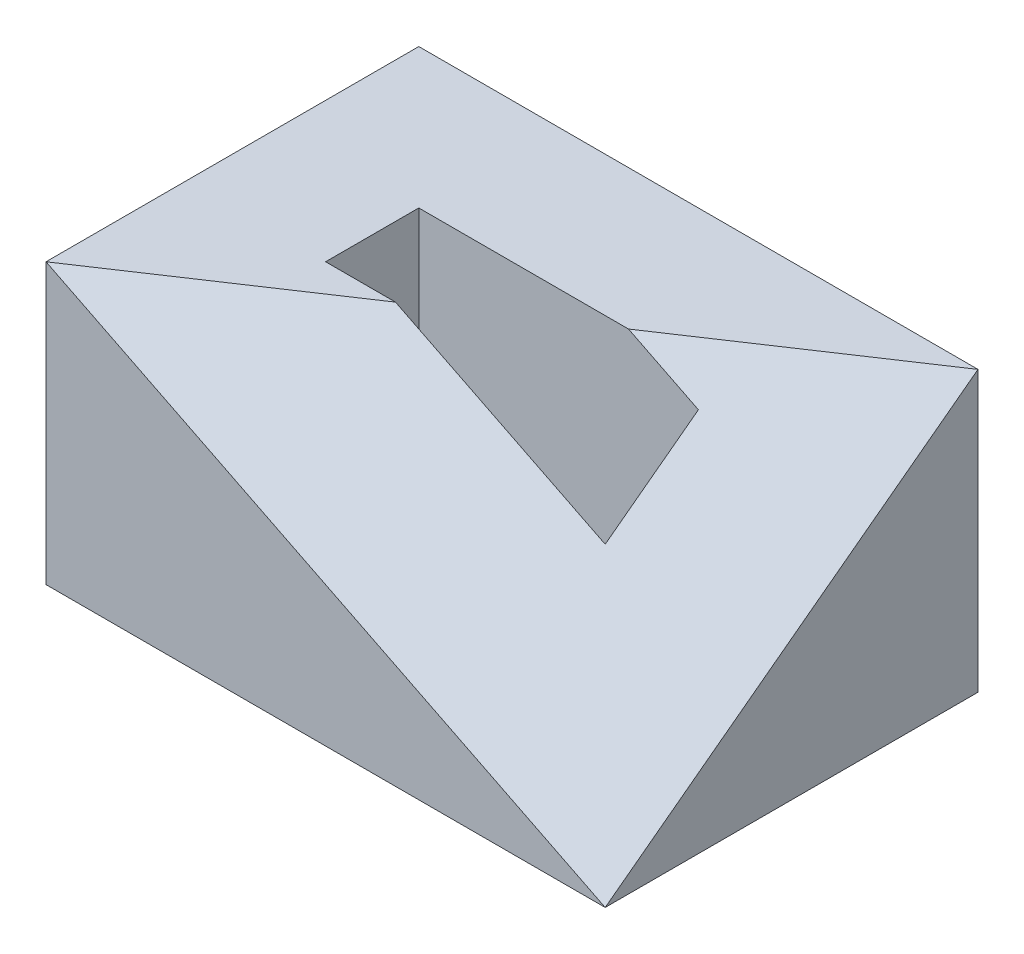
ISO-10303-21;
HEADER;
FILE_DESCRIPTION(('STEP AP214'),'2;1');
FILE_NAME('part.step','',(''),(''),'','','');
FILE_SCHEMA(('AUTOMOTIVE_DESIGN { 1 0 10303 214 1 1 1 1 }'));
ENDSEC;
DATA;
#1=APPLICATION_CONTEXT('core data for automotive mechanical design processes');
#2=APPLICATION_PROTOCOL_DEFINITION('international standard','automotive_design',2000,#1);
#3=PRODUCT_CONTEXT('',#1,'mechanical');
#4=PRODUCT('Part','Part','',(#3));
#5=PRODUCT_RELATED_PRODUCT_CATEGORY('part','',(#4));
#6=PRODUCT_DEFINITION_FORMATION('','',#4);
#7=PRODUCT_DEFINITION_CONTEXT('part definition',#1,'design');
#8=PRODUCT_DEFINITION('design','',#6,#7);
#9=PRODUCT_DEFINITION_SHAPE('','',#8);
#10=(LENGTH_UNIT() NAMED_UNIT(*) SI_UNIT(.MILLI.,.METRE.));
#11=(NAMED_UNIT(*) PLANE_ANGLE_UNIT() SI_UNIT($,.RADIAN.));
#12=(NAMED_UNIT(*) SI_UNIT($,.STERADIAN.) SOLID_ANGLE_UNIT());
#13=UNCERTAINTY_MEASURE_WITH_UNIT(LENGTH_MEASURE(1.E-05),#10,'distance_accuracy_value','');
#14=(GEOMETRIC_REPRESENTATION_CONTEXT(3) GLOBAL_UNCERTAINTY_ASSIGNED_CONTEXT((#13)) GLOBAL_UNIT_ASSIGNED_CONTEXT((#10,
#11,#12)) REPRESENTATION_CONTEXT('',''));
#15=CARTESIAN_POINT('',(0.,0.,0.));
#16=DIRECTION('',(0.,0.,1.));
#17=DIRECTION('',(1.,0.,0.));
#18=AXIS2_PLACEMENT_3D('',#15,#16,#17);
#19=CARTESIAN_POINT('',(60.,30.,0.));
#20=DIRECTION('',(-1.,0.,0.));
#21=DIRECTION('',(0.,0.,1.));
#22=AXIS2_PLACEMENT_3D('',#19,#20,#21);
#23=PLANE('',#22);
#24=DIRECTION('',(0.,0.6,-0.8));
#25=VECTOR('',#24,1.);
#26=CARTESIAN_POINT('',(60.,0.,0.));
#27=LINE('',#26,#25);
#28=CARTESIAN_POINT('',(60.,0.,0.));
#29=VERTEX_POINT('',#28);
#30=CARTESIAN_POINT('',(60.,30.,-40.));
#31=VERTEX_POINT('',#30);
#32=EDGE_CURVE('E135',#29,#31,#27,.T.);
#33=ORIENTED_EDGE('',*,*,#32,.F.);
#34=DIRECTION('',(0.,0.,-1.));
#35=VECTOR('',#34,1.);
#36=CARTESIAN_POINT('',(60.,0.,0.));
#37=LINE('',#36,#35);
#38=CARTESIAN_POINT('',(60.,0.,-40.));
#39=VERTEX_POINT('',#38);
#40=EDGE_CURVE('E173',#29,#39,#37,.T.);
#41=ORIENTED_EDGE('',*,*,#40,.T.);
#42=DIRECTION('',(0.,-1.,0.));
#43=VECTOR('',#42,1.);
#44=CARTESIAN_POINT('',(60.,30.,-40.));
#45=LINE('',#44,#43);
#46=EDGE_CURVE('E169',#31,#39,#45,.T.);
#47=ORIENTED_EDGE('',*,*,#46,.F.);
#48=EDGE_LOOP('',(#33,#41,#47));
#49=FACE_BOUND('',#48,.T.);
#50=ADVANCED_FACE('F36',(#49),#23,.F.);
#51=CARTESIAN_POINT('',(0.,30.,0.));
#52=DIRECTION('',(0.,-1.,0.));
#53=DIRECTION('',(0.,0.,-1.));
#54=AXIS2_PLACEMENT_3D('',#51,#52,#53);
#55=PLANE('',#54);
#56=DIRECTION('',(0.,0.,1.));
#57=VECTOR('',#56,1.);
#58=CARTESIAN_POINT('',(15.,30.,-25.));
#59=LINE('',#58,#57);
#60=CARTESIAN_POINT('',(15.,30.,-25.));
#61=VERTEX_POINT('',#60);
#62=CARTESIAN_POINT('',(15.,30.,-15.));
#63=VERTEX_POINT('',#62);
#64=EDGE_CURVE('E110',#61,#63,#59,.T.);
#65=ORIENTED_EDGE('',*,*,#64,.F.);
#66=DIRECTION('',(-1.,0.,0.));
#67=VECTOR('',#66,1.);
#68=CARTESIAN_POINT('',(45.,30.,-25.));
#69=LINE('',#68,#67);
#70=CARTESIAN_POINT('',(37.5,30.,-25.));
#71=VERTEX_POINT('',#70);
#72=EDGE_CURVE('E107',#71,#61,#69,.T.);
#73=ORIENTED_EDGE('',*,*,#72,.F.);
#74=DIRECTION('',(-0.832050294337844,0.,0.554700196225229));
#75=VECTOR('',#74,1.);
#76=CARTESIAN_POINT('',(60.,30.,-40.));
#77=LINE('',#76,#75);
#78=EDGE_CURVE('E136',#31,#71,#77,.T.);
#79=ORIENTED_EDGE('',*,*,#78,.F.);
#80=DIRECTION('',(-1.,0.,0.));
#81=VECTOR('',#80,1.);
#82=CARTESIAN_POINT('',(0.,30.,-40.));
#83=LINE('',#82,#81);
#84=CARTESIAN_POINT('',(0.,30.,-40.));
#85=VERTEX_POINT('',#84);
#86=EDGE_CURVE('E164',#31,#85,#83,.T.);
#87=ORIENTED_EDGE('',*,*,#86,.T.);
#88=DIRECTION('',(0.,0.,1.));
#89=VECTOR('',#88,1.);
#90=CARTESIAN_POINT('',(0.,30.,0.));
#91=LINE('',#90,#89);
#92=CARTESIAN_POINT('',(0.,30.,0.));
#93=VERTEX_POINT('',#92);
#94=EDGE_CURVE('E181',#85,#93,#91,.T.);
#95=ORIENTED_EDGE('',*,*,#94,.T.);
#96=CARTESIAN_POINT('',(22.5,30.,-15.));
#97=VERTEX_POINT('',#96);
#98=EDGE_CURVE('E121',#97,#93,#77,.T.);
#99=ORIENTED_EDGE('',*,*,#98,.F.);
#100=DIRECTION('',(1.,0.,0.));
#101=VECTOR('',#100,1.);
#102=CARTESIAN_POINT('',(15.,30.,-15.));
#103=LINE('',#102,#101);
#104=EDGE_CURVE('E57',#63,#97,#103,.T.);
#105=ORIENTED_EDGE('',*,*,#104,.F.);
#106=EDGE_LOOP('',(#65,#73,#79,#87,#95,#99,#105));
#107=FACE_BOUND('',#106,.T.);
#108=ADVANCED_FACE('F119',(#107),#55,.F.);
#109=CARTESIAN_POINT('',(0.,30.,0.));
#110=DIRECTION('',(1.,0.,0.));
#111=DIRECTION('',(0.,0.,-1.));
#112=AXIS2_PLACEMENT_3D('',#109,#110,#111);
#113=PLANE('',#112);
#114=DIRECTION('',(0.,0.,1.));
#115=VECTOR('',#114,1.);
#116=CARTESIAN_POINT('',(0.,0.,0.));
#117=LINE('',#116,#115);
#118=CARTESIAN_POINT('',(0.,0.,-40.));
#119=VERTEX_POINT('',#118);
#120=CARTESIAN_POINT('',(0.,0.,0.));
#121=VERTEX_POINT('',#120);
#122=EDGE_CURVE('E139',#119,#121,#117,.T.);
#123=ORIENTED_EDGE('',*,*,#122,.T.);
#124=DIRECTION('',(0.,-1.,0.));
#125=VECTOR('',#124,1.);
#126=CARTESIAN_POINT('',(0.,30.,0.));
#127=LINE('',#126,#125);
#128=EDGE_CURVE('E153',#93,#121,#127,.T.);
#129=ORIENTED_EDGE('',*,*,#128,.F.);
#130=ORIENTED_EDGE('',*,*,#94,.F.);
#131=DIRECTION('',(0.,-1.,0.));
#132=VECTOR('',#131,1.);
#133=CARTESIAN_POINT('',(0.,30.,-40.));
#134=LINE('',#133,#132);
#135=EDGE_CURVE('E176',#85,#119,#134,.T.);
#136=ORIENTED_EDGE('',*,*,#135,.T.);
#137=EDGE_LOOP('',(#123,#129,#130,#136));
#138=FACE_BOUND('',#137,.T.);
#139=ADVANCED_FACE('F38',(#138),#113,.F.);
#140=CARTESIAN_POINT('',(0.,30.,0.));
#141=DIRECTION('',(0.,0.,-1.));
#142=DIRECTION('',(-1.,0.,0.));
#143=AXIS2_PLACEMENT_3D('',#140,#141,#142);
#144=PLANE('',#143);
#145=DIRECTION('',(1.,0.,0.));
#146=VECTOR('',#145,1.);
#147=CARTESIAN_POINT('',(0.,0.,0.));
#148=LINE('',#147,#146);
#149=EDGE_CURVE('E193',#121,#29,#148,.T.);
#150=ORIENTED_EDGE('',*,*,#149,.T.);
#151=DIRECTION('',(-0.894427190999916,0.447213595499958,0.));
#152=VECTOR('',#151,1.);
#153=CARTESIAN_POINT('',(60.,0.,0.));
#154=LINE('',#153,#152);
#155=EDGE_CURVE('E147',#29,#93,#154,.T.);
#156=ORIENTED_EDGE('',*,*,#155,.T.);
#157=ORIENTED_EDGE('',*,*,#128,.T.);
#158=EDGE_LOOP('',(#150,#156,#157));
#159=FACE_BOUND('',#158,.T.);
#160=ADVANCED_FACE('F210',(#159),#144,.F.);
#161=CARTESIAN_POINT('',(0.,30.,-40.));
#162=DIRECTION('',(0.,0.,1.));
#163=DIRECTION('',(1.,0.,0.));
#164=AXIS2_PLACEMENT_3D('',#161,#162,#163);
#165=PLANE('',#164);
#166=DIRECTION('',(-1.,0.,0.));
#167=VECTOR('',#166,1.);
#168=CARTESIAN_POINT('',(0.,0.,-40.));
#169=LINE('',#168,#167);
#170=EDGE_CURVE('E184',#39,#119,#169,.T.);
#171=ORIENTED_EDGE('',*,*,#170,.T.);
#172=ORIENTED_EDGE('',*,*,#135,.F.);
#173=ORIENTED_EDGE('',*,*,#86,.F.);
#174=ORIENTED_EDGE('',*,*,#46,.T.);
#175=EDGE_LOOP('',(#171,#172,#173,#174));
#176=FACE_BOUND('',#175,.T.);
#177=ADVANCED_FACE('F178',(#176),#165,.F.);
#178=CARTESIAN_POINT('',(0.,0.,0.));
#179=DIRECTION('',(0.,-1.,0.));
#180=DIRECTION('',(0.,0.,-1.));
#181=AXIS2_PLACEMENT_3D('',#178,#179,#180);
#182=PLANE('',#181);
#183=DIRECTION('',(0.,0.,-1.));
#184=VECTOR('',#183,1.);
#185=CARTESIAN_POINT('',(15.,0.,0.));
#186=LINE('',#185,#184);
#187=CARTESIAN_POINT('',(15.,0.,-15.));
#188=VERTEX_POINT('',#187);
#189=CARTESIAN_POINT('',(15.,0.,-25.));
#190=VERTEX_POINT('',#189);
#191=EDGE_CURVE('E12',#188,#190,#186,.T.);
#192=ORIENTED_EDGE('',*,*,#191,.F.);
#193=DIRECTION('',(-1.,0.,0.));
#194=VECTOR('',#193,1.);
#195=CARTESIAN_POINT('',(0.,0.,-15.));
#196=LINE('',#195,#194);
#197=CARTESIAN_POINT('',(45.,0.,-15.));
#198=VERTEX_POINT('',#197);
#199=EDGE_CURVE('E104',#198,#188,#196,.T.);
#200=ORIENTED_EDGE('',*,*,#199,.F.);
#201=DIRECTION('',(0.,0.,1.));
#202=VECTOR('',#201,1.);
#203=CARTESIAN_POINT('',(45.,0.,0.));
#204=LINE('',#203,#202);
#205=CARTESIAN_POINT('',(45.,0.,-25.));
#206=VERTEX_POINT('',#205);
#207=EDGE_CURVE('E131',#206,#198,#204,.T.);
#208=ORIENTED_EDGE('',*,*,#207,.F.);
#209=DIRECTION('',(1.,0.,0.));
#210=VECTOR('',#209,1.);
#211=CARTESIAN_POINT('',(0.,0.,-25.));
#212=LINE('',#211,#210);
#213=EDGE_CURVE('E133',#190,#206,#212,.T.);
#214=ORIENTED_EDGE('',*,*,#213,.F.);
#215=EDGE_LOOP('',(#192,#200,#208,#214));
#216=FACE_BOUND('',#215,.T.);
#217=ORIENTED_EDGE('',*,*,#122,.F.);
#218=ORIENTED_EDGE('',*,*,#170,.F.);
#219=ORIENTED_EDGE('',*,*,#40,.F.);
#220=ORIENTED_EDGE('',*,*,#149,.F.);
#221=EDGE_LOOP('',(#217,#218,#219,#220));
#222=FACE_BOUND('',#221,.T.);
#223=ADVANCED_FACE('F217',(#216,#222),#182,.T.);
#224=CARTESIAN_POINT('',(8.27586206896552,16.551724137931,12.4137931034483));
#225=DIRECTION('',(-0.371390676354104,-0.742781352708207,-0.557086014531155));
#226=DIRECTION('',(0.,0.6,-0.8));
#227=AXIS2_PLACEMENT_3D('',#224,#225,#226);
#228=PLANE('',#227);
#229=ORIENTED_EDGE('',*,*,#78,.T.);
#230=DIRECTION('',(0.894427190999916,-0.447213595499958,0.));
#231=VECTOR('',#230,1.);
#232=CARTESIAN_POINT('',(19.5,39.,-25.));
#233=LINE('',#232,#231);
#234=CARTESIAN_POINT('',(45.,26.25,-25.));
#235=VERTEX_POINT('',#234);
#236=EDGE_CURVE('E44',#71,#235,#233,.T.);
#237=ORIENTED_EDGE('',*,*,#236,.T.);
#238=DIRECTION('',(0.,-0.6,0.8));
#239=VECTOR('',#238,1.);
#240=CARTESIAN_POINT('',(45.,4.8,3.6));
#241=LINE('',#240,#239);
#242=CARTESIAN_POINT('',(45.,18.75,-15.));
#243=VERTEX_POINT('',#242);
#244=EDGE_CURVE('E152',#235,#243,#241,.T.);
#245=ORIENTED_EDGE('',*,*,#244,.T.);
#246=DIRECTION('',(-0.894427190999916,0.447213595499958,0.));
#247=VECTOR('',#246,1.);
#248=CARTESIAN_POINT('',(16.5,33.,-15.));
#249=LINE('',#248,#247);
#250=EDGE_CURVE('E150',#243,#97,#249,.T.);
#251=ORIENTED_EDGE('',*,*,#250,.T.);
#252=ORIENTED_EDGE('',*,*,#98,.T.);
#253=ORIENTED_EDGE('',*,*,#155,.F.);
#254=ORIENTED_EDGE('',*,*,#32,.T.);
#255=EDGE_LOOP('',(#229,#237,#245,#251,#252,#253,#254));
#256=FACE_BOUND('',#255,.T.);
#257=ADVANCED_FACE('F157',(#256),#228,.F.);
#258=CARTESIAN_POINT('',(45.,-20.,-25.));
#259=DIRECTION('',(0.,0.,-1.));
#260=DIRECTION('',(-1.,0.,0.));
#261=AXIS2_PLACEMENT_3D('',#258,#259,#260);
#262=PLANE('',#261);
#263=ORIENTED_EDGE('',*,*,#213,.T.);
#264=DIRECTION('',(0.,1.,0.));
#265=VECTOR('',#264,1.);
#266=CARTESIAN_POINT('',(45.,-20.,-25.));
#267=LINE('',#266,#265);
#268=EDGE_CURVE('E126',#206,#235,#267,.T.);
#269=ORIENTED_EDGE('',*,*,#268,.T.);
#270=ORIENTED_EDGE('',*,*,#236,.F.);
#271=ORIENTED_EDGE('',*,*,#72,.T.);
#272=DIRECTION('',(0.,1.,0.));
#273=VECTOR('',#272,1.);
#274=CARTESIAN_POINT('',(15.,-20.,-25.));
#275=LINE('',#274,#273);
#276=EDGE_CURVE('E113',#190,#61,#275,.T.);
#277=ORIENTED_EDGE('',*,*,#276,.F.);
#278=EDGE_LOOP('',(#263,#269,#270,#271,#277));
#279=FACE_BOUND('',#278,.T.);
#280=ADVANCED_FACE('F160',(#279),#262,.F.);
#281=CARTESIAN_POINT('',(45.,-20.,-15.));
#282=DIRECTION('',(1.,0.,0.));
#283=DIRECTION('',(0.,0.,-1.));
#284=AXIS2_PLACEMENT_3D('',#281,#282,#283);
#285=PLANE('',#284);
#286=ORIENTED_EDGE('',*,*,#207,.T.);
#287=DIRECTION('',(0.,1.,0.));
#288=VECTOR('',#287,1.);
#289=CARTESIAN_POINT('',(45.,-20.,-15.));
#290=LINE('',#289,#288);
#291=EDGE_CURVE('E51',#198,#243,#290,.T.);
#292=ORIENTED_EDGE('',*,*,#291,.T.);
#293=ORIENTED_EDGE('',*,*,#244,.F.);
#294=ORIENTED_EDGE('',*,*,#268,.F.);
#295=EDGE_LOOP('',(#286,#292,#293,#294));
#296=FACE_BOUND('',#295,.T.);
#297=ADVANCED_FACE('F252',(#296),#285,.F.);
#298=CARTESIAN_POINT('',(15.,-20.,-15.));
#299=DIRECTION('',(0.,0.,1.));
#300=DIRECTION('',(1.,0.,0.));
#301=AXIS2_PLACEMENT_3D('',#298,#299,#300);
#302=PLANE('',#301);
#303=ORIENTED_EDGE('',*,*,#199,.T.);
#304=DIRECTION('',(0.,1.,0.));
#305=VECTOR('',#304,1.);
#306=CARTESIAN_POINT('',(15.,-20.,-15.));
#307=LINE('',#306,#305);
#308=EDGE_CURVE('E100',#188,#63,#307,.T.);
#309=ORIENTED_EDGE('',*,*,#308,.T.);
#310=ORIENTED_EDGE('',*,*,#104,.T.);
#311=ORIENTED_EDGE('',*,*,#250,.F.);
#312=ORIENTED_EDGE('',*,*,#291,.F.);
#313=EDGE_LOOP('',(#303,#309,#310,#311,#312));
#314=FACE_BOUND('',#313,.T.);
#315=ADVANCED_FACE('F102',(#314),#302,.F.);
#316=CARTESIAN_POINT('',(15.,-20.,-25.));
#317=DIRECTION('',(-1.,0.,0.));
#318=DIRECTION('',(0.,0.,1.));
#319=AXIS2_PLACEMENT_3D('',#316,#317,#318);
#320=PLANE('',#319);
#321=ORIENTED_EDGE('',*,*,#191,.T.);
#322=ORIENTED_EDGE('',*,*,#276,.T.);
#323=ORIENTED_EDGE('',*,*,#64,.T.);
#324=ORIENTED_EDGE('',*,*,#308,.F.);
#325=EDGE_LOOP('',(#321,#322,#323,#324));
#326=FACE_BOUND('',#325,.T.);
#327=ADVANCED_FACE('F111',(#326),#320,.F.);
#328=CLOSED_SHELL('',(#50,#108,#139,#160,#177,#223,#257,#280,#297,#315,#327));
#329=MANIFOLD_SOLID_BREP('B2',#328);
#330=ADVANCED_BREP_SHAPE_REPRESENTATION('',(#18,#329),#14);
#331=SHAPE_DEFINITION_REPRESENTATION(#9,#330);
ENDSEC;
END-ISO-10303-21;
